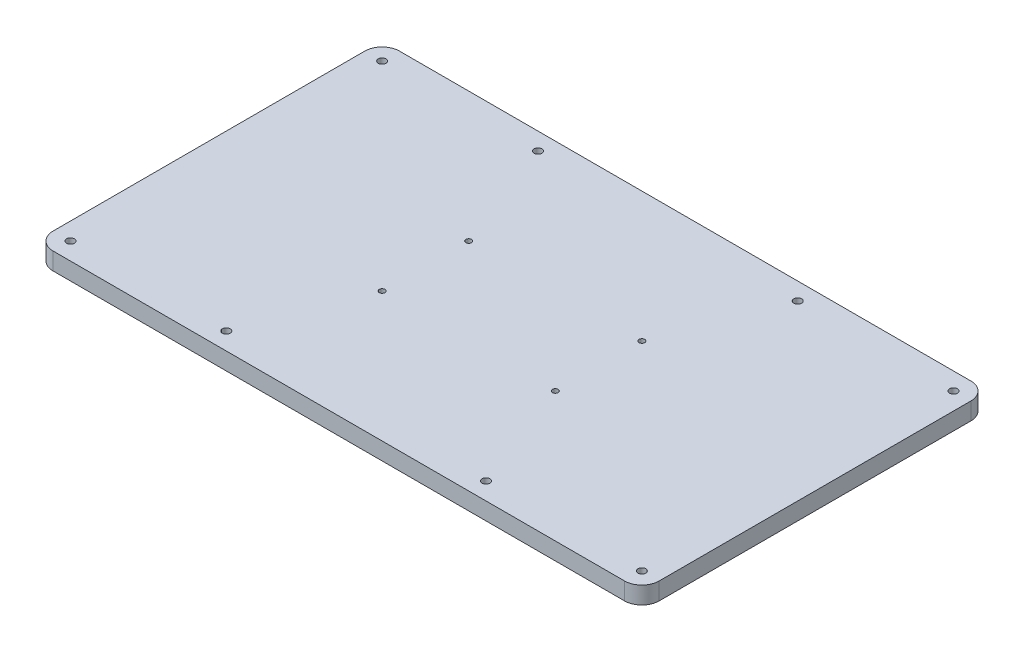
ISO-10303-21;
HEADER;
FILE_DESCRIPTION(('STEP AP214'),'2;1');
FILE_NAME('part.step','',(''),(''),'','','');
FILE_SCHEMA(('AUTOMOTIVE_DESIGN { 1 0 10303 214 1 1 1 1 }'));
ENDSEC;
DATA;
#1=APPLICATION_CONTEXT('core data for automotive mechanical design processes');
#2=APPLICATION_PROTOCOL_DEFINITION('international standard','automotive_design',2000,#1);
#3=PRODUCT_CONTEXT('',#1,'mechanical');
#4=PRODUCT('Part','Part','',(#3));
#5=PRODUCT_RELATED_PRODUCT_CATEGORY('part','',(#4));
#6=PRODUCT_DEFINITION_FORMATION('','',#4);
#7=PRODUCT_DEFINITION_CONTEXT('part definition',#1,'design');
#8=PRODUCT_DEFINITION('design','',#6,#7);
#9=PRODUCT_DEFINITION_SHAPE('','',#8);
#10=(LENGTH_UNIT() NAMED_UNIT(*) SI_UNIT(.MILLI.,.METRE.));
#11=(NAMED_UNIT(*) PLANE_ANGLE_UNIT() SI_UNIT($,.RADIAN.));
#12=(NAMED_UNIT(*) SI_UNIT($,.STERADIAN.) SOLID_ANGLE_UNIT());
#13=UNCERTAINTY_MEASURE_WITH_UNIT(LENGTH_MEASURE(1.E-05),#10,'distance_accuracy_value','');
#14=(GEOMETRIC_REPRESENTATION_CONTEXT(3) GLOBAL_UNCERTAINTY_ASSIGNED_CONTEXT((#13)) GLOBAL_UNIT_ASSIGNED_CONTEXT((#10,
#11,#12)) REPRESENTATION_CONTEXT('',''));
#15=CARTESIAN_POINT('',(0.,0.,0.));
#16=DIRECTION('',(0.,0.,1.));
#17=DIRECTION('',(1.,0.,0.));
#18=AXIS2_PLACEMENT_3D('',#15,#16,#17);
#19=CARTESIAN_POINT('',(0.,10.,0.));
#20=DIRECTION('',(1.,0.,0.));
#21=DIRECTION('',(0.,0.,-1.));
#22=AXIS2_PLACEMENT_3D('',#19,#20,#21);
#23=PLANE('',#22);
#24=DIRECTION('',(0.,0.,1.));
#25=VECTOR('',#24,1.);
#26=CARTESIAN_POINT('',(0.,10.,0.));
#27=LINE('',#26,#25);
#28=CARTESIAN_POINT('',(0.,10.,-190.));
#29=VERTEX_POINT('',#28);
#30=CARTESIAN_POINT('',(0.,10.,-10.));
#31=VERTEX_POINT('',#30);
#32=EDGE_CURVE('E132',#29,#31,#27,.T.);
#33=ORIENTED_EDGE('',*,*,#32,.F.);
#34=DIRECTION('',(0.,-1.,0.));
#35=VECTOR('',#34,1.);
#36=CARTESIAN_POINT('',(0.,10.,-190.));
#37=LINE('',#36,#35);
#38=CARTESIAN_POINT('',(0.,0.,-190.));
#39=VERTEX_POINT('',#38);
#40=EDGE_CURVE('E11',#29,#39,#37,.T.);
#41=ORIENTED_EDGE('',*,*,#40,.T.);
#42=DIRECTION('',(0.,0.,1.));
#43=VECTOR('',#42,1.);
#44=CARTESIAN_POINT('',(0.,0.,0.));
#45=LINE('',#44,#43);
#46=CARTESIAN_POINT('',(0.,0.,-10.));
#47=VERTEX_POINT('',#46);
#48=EDGE_CURVE('E134',#39,#47,#45,.T.);
#49=ORIENTED_EDGE('',*,*,#48,.T.);
#50=DIRECTION('',(0.,-1.,0.));
#51=VECTOR('',#50,1.);
#52=CARTESIAN_POINT('',(0.,10.,-10.));
#53=LINE('',#52,#51);
#54=EDGE_CURVE('E45',#47,#31,#53,.F.);
#55=ORIENTED_EDGE('',*,*,#54,.T.);
#56=EDGE_LOOP('',(#33,#41,#49,#55));
#57=FACE_BOUND('',#56,.T.);
#58=ADVANCED_FACE('F37',(#57),#23,.F.);
#59=CARTESIAN_POINT('',(0.,10.,0.));
#60=DIRECTION('',(0.,0.,-1.));
#61=DIRECTION('',(-1.,0.,0.));
#62=AXIS2_PLACEMENT_3D('',#59,#60,#61);
#63=PLANE('',#62);
#64=DIRECTION('',(1.,0.,0.));
#65=VECTOR('',#64,1.);
#66=CARTESIAN_POINT('',(0.,0.,0.));
#67=LINE('',#66,#65);
#68=CARTESIAN_POINT('',(10.,0.,0.));
#69=VERTEX_POINT('',#68);
#70=CARTESIAN_POINT('',(340.,0.,0.));
#71=VERTEX_POINT('',#70);
#72=EDGE_CURVE('E130',#69,#71,#67,.T.);
#73=ORIENTED_EDGE('',*,*,#72,.T.);
#74=DIRECTION('',(0.,-1.,0.));
#75=VECTOR('',#74,1.);
#76=CARTESIAN_POINT('',(340.,10.,0.));
#77=LINE('',#76,#75);
#78=CARTESIAN_POINT('',(340.,10.,0.));
#79=VERTEX_POINT('',#78);
#80=EDGE_CURVE('E109',#71,#79,#77,.F.);
#81=ORIENTED_EDGE('',*,*,#80,.T.);
#82=DIRECTION('',(1.,0.,0.));
#83=VECTOR('',#82,1.);
#84=CARTESIAN_POINT('',(0.,10.,0.));
#85=LINE('',#84,#83);
#86=CARTESIAN_POINT('',(10.,10.,0.));
#87=VERTEX_POINT('',#86);
#88=EDGE_CURVE('E170',#87,#79,#85,.T.);
#89=ORIENTED_EDGE('',*,*,#88,.F.);
#90=DIRECTION('',(0.,-1.,0.));
#91=VECTOR('',#90,1.);
#92=CARTESIAN_POINT('',(10.,10.,0.));
#93=LINE('',#92,#91);
#94=EDGE_CURVE('E114',#87,#69,#93,.T.);
#95=ORIENTED_EDGE('',*,*,#94,.T.);
#96=EDGE_LOOP('',(#73,#81,#89,#95));
#97=FACE_BOUND('',#96,.T.);
#98=ADVANCED_FACE('F174',(#97),#63,.F.);
#99=CARTESIAN_POINT('',(350.,10.,0.));
#100=DIRECTION('',(-1.,0.,0.));
#101=DIRECTION('',(0.,0.,1.));
#102=AXIS2_PLACEMENT_3D('',#99,#100,#101);
#103=PLANE('',#102);
#104=DIRECTION('',(0.,0.,-1.));
#105=VECTOR('',#104,1.);
#106=CARTESIAN_POINT('',(350.,10.,0.));
#107=LINE('',#106,#105);
#108=CARTESIAN_POINT('',(350.,10.,-10.));
#109=VERTEX_POINT('',#108);
#110=CARTESIAN_POINT('',(350.,10.,-190.));
#111=VERTEX_POINT('',#110);
#112=EDGE_CURVE('E123',#109,#111,#107,.T.);
#113=ORIENTED_EDGE('',*,*,#112,.F.);
#114=DIRECTION('',(0.,-1.,0.));
#115=VECTOR('',#114,1.);
#116=CARTESIAN_POINT('',(350.,10.,-10.));
#117=LINE('',#116,#115);
#118=CARTESIAN_POINT('',(350.,0.,-10.));
#119=VERTEX_POINT('',#118);
#120=EDGE_CURVE('E108',#109,#119,#117,.T.);
#121=ORIENTED_EDGE('',*,*,#120,.T.);
#122=DIRECTION('',(0.,0.,-1.));
#123=VECTOR('',#122,1.);
#124=CARTESIAN_POINT('',(350.,0.,0.));
#125=LINE('',#124,#123);
#126=CARTESIAN_POINT('',(350.,0.,-190.));
#127=VERTEX_POINT('',#126);
#128=EDGE_CURVE('E121',#119,#127,#125,.T.);
#129=ORIENTED_EDGE('',*,*,#128,.T.);
#130=DIRECTION('',(0.,-1.,0.));
#131=VECTOR('',#130,1.);
#132=CARTESIAN_POINT('',(350.,10.,-190.));
#133=LINE('',#132,#131);
#134=EDGE_CURVE('E125',#127,#111,#133,.F.);
#135=ORIENTED_EDGE('',*,*,#134,.T.);
#136=EDGE_LOOP('',(#113,#121,#129,#135));
#137=FACE_BOUND('',#136,.T.);
#138=ADVANCED_FACE('F120',(#137),#103,.F.);
#139=CARTESIAN_POINT('',(0.,10.,-200.));
#140=DIRECTION('',(0.,0.,1.));
#141=DIRECTION('',(1.,0.,0.));
#142=AXIS2_PLACEMENT_3D('',#139,#140,#141);
#143=PLANE('',#142);
#144=DIRECTION('',(-1.,0.,0.));
#145=VECTOR('',#144,1.);
#146=CARTESIAN_POINT('',(0.,10.,-200.));
#147=LINE('',#146,#145);
#148=CARTESIAN_POINT('',(340.,10.,-200.));
#149=VERTEX_POINT('',#148);
#150=CARTESIAN_POINT('',(10.,10.,-200.));
#151=VERTEX_POINT('',#150);
#152=EDGE_CURVE('E138',#149,#151,#147,.T.);
#153=ORIENTED_EDGE('',*,*,#152,.F.);
#154=DIRECTION('',(0.,-1.,0.));
#155=VECTOR('',#154,1.);
#156=CARTESIAN_POINT('',(340.,10.,-200.));
#157=LINE('',#156,#155);
#158=CARTESIAN_POINT('',(340.,0.,-200.));
#159=VERTEX_POINT('',#158);
#160=EDGE_CURVE('E155',#149,#159,#157,.T.);
#161=ORIENTED_EDGE('',*,*,#160,.T.);
#162=DIRECTION('',(-1.,0.,0.));
#163=VECTOR('',#162,1.);
#164=CARTESIAN_POINT('',(0.,0.,-200.));
#165=LINE('',#164,#163);
#166=CARTESIAN_POINT('',(10.,0.,-200.));
#167=VERTEX_POINT('',#166);
#168=EDGE_CURVE('E129',#159,#167,#165,.T.);
#169=ORIENTED_EDGE('',*,*,#168,.T.);
#170=DIRECTION('',(0.,-1.,0.));
#171=VECTOR('',#170,1.);
#172=CARTESIAN_POINT('',(10.,10.,-200.));
#173=LINE('',#172,#171);
#174=EDGE_CURVE('E52',#167,#151,#173,.F.);
#175=ORIENTED_EDGE('',*,*,#174,.T.);
#176=EDGE_LOOP('',(#153,#161,#169,#175));
#177=FACE_BOUND('',#176,.T.);
#178=ADVANCED_FACE('F256',(#177),#143,.F.);
#179=CARTESIAN_POINT('',(0.,10.,0.));
#180=DIRECTION('',(0.,-1.,0.));
#181=DIRECTION('',(0.,0.,-1.));
#182=AXIS2_PLACEMENT_3D('',#179,#180,#181);
#183=PLANE('',#182);
#184=CARTESIAN_POINT('',(10.,10.,-10.));
#185=DIRECTION('',(0.,1.,0.));
#186=DIRECTION('',(0.,0.,1.));
#187=AXIS2_PLACEMENT_3D('',#184,#185,#186);
#188=CIRCLE('',#187,2.24999999999999);
#189=CARTESIAN_POINT('',(10.,10.,-7.75000000000001));
#190=VERTEX_POINT('',#189);
#191=EDGE_CURVE('E248',#190,#190,#188,.T.);
#192=ORIENTED_EDGE('',*,*,#191,.F.);
#193=EDGE_LOOP('',(#192));
#194=FACE_BOUND('',#193,.T.);
#195=CARTESIAN_POINT('',(100.,10.,-10.));
#196=DIRECTION('',(0.,1.,0.));
#197=DIRECTION('',(0.,0.,1.));
#198=AXIS2_PLACEMENT_3D('',#195,#196,#197);
#199=CIRCLE('',#198,2.24999999999999);
#200=CARTESIAN_POINT('',(100.,10.,-7.75000000000001));
#201=VERTEX_POINT('',#200);
#202=EDGE_CURVE('E242',#201,#201,#199,.T.);
#203=ORIENTED_EDGE('',*,*,#202,.F.);
#204=EDGE_LOOP('',(#203));
#205=FACE_BOUND('',#204,.T.);
#206=CARTESIAN_POINT('',(100.,10.,-190.));
#207=DIRECTION('',(0.,1.,0.));
#208=DIRECTION('',(0.,0.,1.));
#209=AXIS2_PLACEMENT_3D('',#206,#207,#208);
#210=CIRCLE('',#209,2.24999999999999);
#211=CARTESIAN_POINT('',(100.,10.,-187.75));
#212=VERTEX_POINT('',#211);
#213=EDGE_CURVE('E236',#212,#212,#210,.T.);
#214=ORIENTED_EDGE('',*,*,#213,.F.);
#215=EDGE_LOOP('',(#214));
#216=FACE_BOUND('',#215,.T.);
#217=CARTESIAN_POINT('',(10.,10.,-190.));
#218=DIRECTION('',(0.,1.,0.));
#219=DIRECTION('',(0.,0.,1.));
#220=AXIS2_PLACEMENT_3D('',#217,#218,#219);
#221=CIRCLE('',#220,2.24999999999999);
#222=CARTESIAN_POINT('',(10.,10.,-187.75));
#223=VERTEX_POINT('',#222);
#224=EDGE_CURVE('E230',#223,#223,#221,.T.);
#225=ORIENTED_EDGE('',*,*,#224,.F.);
#226=EDGE_LOOP('',(#225));
#227=FACE_BOUND('',#226,.T.);
#228=CARTESIAN_POINT('',(250.,10.,-190.));
#229=DIRECTION('',(0.,1.,0.));
#230=DIRECTION('',(0.,0.,1.));
#231=AXIS2_PLACEMENT_3D('',#228,#229,#230);
#232=CIRCLE('',#231,2.24999999999997);
#233=CARTESIAN_POINT('',(250.,10.,-187.75));
#234=VERTEX_POINT('',#233);
#235=EDGE_CURVE('E224',#234,#234,#232,.T.);
#236=ORIENTED_EDGE('',*,*,#235,.F.);
#237=EDGE_LOOP('',(#236));
#238=FACE_BOUND('',#237,.T.);
#239=CARTESIAN_POINT('',(340.,10.,-190.));
#240=DIRECTION('',(0.,1.,0.));
#241=DIRECTION('',(0.,0.,1.));
#242=AXIS2_PLACEMENT_3D('',#239,#240,#241);
#243=CIRCLE('',#242,2.24999999999997);
#244=CARTESIAN_POINT('',(340.,10.,-187.75));
#245=VERTEX_POINT('',#244);
#246=EDGE_CURVE('E218',#245,#245,#243,.T.);
#247=ORIENTED_EDGE('',*,*,#246,.F.);
#248=EDGE_LOOP('',(#247));
#249=FACE_BOUND('',#248,.T.);
#250=CARTESIAN_POINT('',(340.,10.,-10.));
#251=DIRECTION('',(0.,1.,0.));
#252=DIRECTION('',(0.,0.,1.));
#253=AXIS2_PLACEMENT_3D('',#250,#251,#252);
#254=CIRCLE('',#253,2.24999999999997);
#255=CARTESIAN_POINT('',(340.,10.,-7.75000000000003));
#256=VERTEX_POINT('',#255);
#257=EDGE_CURVE('E212',#256,#256,#254,.T.);
#258=ORIENTED_EDGE('',*,*,#257,.F.);
#259=EDGE_LOOP('',(#258));
#260=FACE_BOUND('',#259,.T.);
#261=CARTESIAN_POINT('',(250.,10.,-10.));
#262=DIRECTION('',(0.,1.,0.));
#263=DIRECTION('',(0.,0.,1.));
#264=AXIS2_PLACEMENT_3D('',#261,#262,#263);
#265=CIRCLE('',#264,2.24999999999997);
#266=CARTESIAN_POINT('',(250.,10.,-7.75000000000003));
#267=VERTEX_POINT('',#266);
#268=EDGE_CURVE('E206',#267,#267,#265,.T.);
#269=ORIENTED_EDGE('',*,*,#268,.F.);
#270=EDGE_LOOP('',(#269));
#271=FACE_BOUND('',#270,.T.);
#272=CARTESIAN_POINT('',(125.,10.,-75.));
#273=DIRECTION('',(0.,1.,0.));
#274=DIRECTION('',(0.,0.,1.));
#275=AXIS2_PLACEMENT_3D('',#272,#273,#274);
#276=CIRCLE('',#275,1.65);
#277=CARTESIAN_POINT('',(125.,10.,-73.35));
#278=VERTEX_POINT('',#277);
#279=EDGE_CURVE('E200',#278,#278,#276,.T.);
#280=ORIENTED_EDGE('',*,*,#279,.F.);
#281=EDGE_LOOP('',(#280));
#282=FACE_BOUND('',#281,.T.);
#283=CARTESIAN_POINT('',(125.,10.,-125.));
#284=DIRECTION('',(0.,1.,0.));
#285=DIRECTION('',(0.,0.,1.));
#286=AXIS2_PLACEMENT_3D('',#283,#284,#285);
#287=CIRCLE('',#286,1.65);
#288=CARTESIAN_POINT('',(125.,10.,-123.35));
#289=VERTEX_POINT('',#288);
#290=EDGE_CURVE('E194',#289,#289,#287,.T.);
#291=ORIENTED_EDGE('',*,*,#290,.F.);
#292=EDGE_LOOP('',(#291));
#293=FACE_BOUND('',#292,.T.);
#294=CARTESIAN_POINT('',(225.,10.,-125.));
#295=DIRECTION('',(0.,1.,0.));
#296=DIRECTION('',(0.,0.,1.));
#297=AXIS2_PLACEMENT_3D('',#294,#295,#296);
#298=CIRCLE('',#297,1.64999999999998);
#299=CARTESIAN_POINT('',(225.,10.,-123.35));
#300=VERTEX_POINT('',#299);
#301=EDGE_CURVE('E188',#300,#300,#298,.T.);
#302=ORIENTED_EDGE('',*,*,#301,.F.);
#303=EDGE_LOOP('',(#302));
#304=FACE_BOUND('',#303,.T.);
#305=CARTESIAN_POINT('',(225.,10.,-75.));
#306=DIRECTION('',(0.,1.,0.));
#307=DIRECTION('',(0.,0.,1.));
#308=AXIS2_PLACEMENT_3D('',#305,#306,#307);
#309=CIRCLE('',#308,1.64999999999998);
#310=CARTESIAN_POINT('',(225.,10.,-73.35));
#311=VERTEX_POINT('',#310);
#312=EDGE_CURVE('E177',#311,#311,#309,.T.);
#313=ORIENTED_EDGE('',*,*,#312,.F.);
#314=EDGE_LOOP('',(#313));
#315=FACE_BOUND('',#314,.T.);
#316=ORIENTED_EDGE('',*,*,#88,.T.);
#317=CARTESIAN_POINT('',(340.,10.,-10.));
#318=DIRECTION('',(0.,-1.,0.));
#319=DIRECTION('',(0.,0.,-1.));
#320=AXIS2_PLACEMENT_3D('',#317,#318,#319);
#321=CIRCLE('',#320,10.);
#322=EDGE_CURVE('E152',#79,#109,#321,.F.);
#323=ORIENTED_EDGE('',*,*,#322,.T.);
#324=ORIENTED_EDGE('',*,*,#112,.T.);
#325=CARTESIAN_POINT('',(340.,10.,-190.));
#326=DIRECTION('',(0.,-1.,0.));
#327=DIRECTION('',(0.,0.,-1.));
#328=AXIS2_PLACEMENT_3D('',#325,#326,#327);
#329=CIRCLE('',#328,10.);
#330=EDGE_CURVE('E59',#111,#149,#329,.F.);
#331=ORIENTED_EDGE('',*,*,#330,.T.);
#332=ORIENTED_EDGE('',*,*,#152,.T.);
#333=CARTESIAN_POINT('',(10.,10.,-190.));
#334=DIRECTION('',(0.,-1.,0.));
#335=DIRECTION('',(0.,0.,-1.));
#336=AXIS2_PLACEMENT_3D('',#333,#334,#335);
#337=CIRCLE('',#336,10.);
#338=EDGE_CURVE('E149',#151,#29,#337,.F.);
#339=ORIENTED_EDGE('',*,*,#338,.T.);
#340=ORIENTED_EDGE('',*,*,#32,.T.);
#341=CARTESIAN_POINT('',(10.,10.,-10.));
#342=DIRECTION('',(0.,-1.,0.));
#343=DIRECTION('',(0.,0.,-1.));
#344=AXIS2_PLACEMENT_3D('',#341,#342,#343);
#345=CIRCLE('',#344,10.);
#346=EDGE_CURVE('E147',#31,#87,#345,.F.);
#347=ORIENTED_EDGE('',*,*,#346,.T.);
#348=EDGE_LOOP('',(#316,#323,#324,#331,#332,#339,#340,#347));
#349=FACE_BOUND('',#348,.T.);
#350=ADVANCED_FACE('F167',(#194,#205,#216,#227,#238,#249,#260,#271,#282,#293,#304,#315,#349),
#183,.F.);
#351=CARTESIAN_POINT('',(0.,0.,0.));
#352=DIRECTION('',(0.,-1.,0.));
#353=DIRECTION('',(0.,0.,-1.));
#354=AXIS2_PLACEMENT_3D('',#351,#352,#353);
#355=PLANE('',#354);
#356=CARTESIAN_POINT('',(10.,0.,-10.));
#357=DIRECTION('',(0.,1.,0.));
#358=DIRECTION('',(0.,0.,1.));
#359=AXIS2_PLACEMENT_3D('',#356,#357,#358);
#360=CIRCLE('',#359,2.25);
#361=CARTESIAN_POINT('',(10.,0.,-7.75));
#362=VERTEX_POINT('',#361);
#363=EDGE_CURVE('E245',#362,#362,#360,.T.);
#364=ORIENTED_EDGE('',*,*,#363,.T.);
#365=EDGE_LOOP('',(#364));
#366=FACE_BOUND('',#365,.T.);
#367=CARTESIAN_POINT('',(100.,0.,-10.));
#368=DIRECTION('',(0.,1.,0.));
#369=DIRECTION('',(0.,0.,1.));
#370=AXIS2_PLACEMENT_3D('',#367,#368,#369);
#371=CIRCLE('',#370,2.25);
#372=CARTESIAN_POINT('',(100.,0.,-7.75));
#373=VERTEX_POINT('',#372);
#374=EDGE_CURVE('E239',#373,#373,#371,.T.);
#375=ORIENTED_EDGE('',*,*,#374,.T.);
#376=EDGE_LOOP('',(#375));
#377=FACE_BOUND('',#376,.T.);
#378=CARTESIAN_POINT('',(100.,0.,-190.));
#379=DIRECTION('',(0.,1.,0.));
#380=DIRECTION('',(0.,0.,1.));
#381=AXIS2_PLACEMENT_3D('',#378,#379,#380);
#382=CIRCLE('',#381,2.25);
#383=CARTESIAN_POINT('',(100.,0.,-187.75));
#384=VERTEX_POINT('',#383);
#385=EDGE_CURVE('E233',#384,#384,#382,.T.);
#386=ORIENTED_EDGE('',*,*,#385,.T.);
#387=EDGE_LOOP('',(#386));
#388=FACE_BOUND('',#387,.T.);
#389=CARTESIAN_POINT('',(10.,0.,-190.));
#390=DIRECTION('',(0.,1.,0.));
#391=DIRECTION('',(0.,0.,1.));
#392=AXIS2_PLACEMENT_3D('',#389,#390,#391);
#393=CIRCLE('',#392,2.25);
#394=CARTESIAN_POINT('',(10.,0.,-187.75));
#395=VERTEX_POINT('',#394);
#396=EDGE_CURVE('E227',#395,#395,#393,.T.);
#397=ORIENTED_EDGE('',*,*,#396,.T.);
#398=EDGE_LOOP('',(#397));
#399=FACE_BOUND('',#398,.T.);
#400=CARTESIAN_POINT('',(250.,0.,-190.));
#401=DIRECTION('',(0.,1.,0.));
#402=DIRECTION('',(0.,0.,1.));
#403=AXIS2_PLACEMENT_3D('',#400,#401,#402);
#404=CIRCLE('',#403,2.24999999999997);
#405=CARTESIAN_POINT('',(250.,0.,-187.75));
#406=VERTEX_POINT('',#405);
#407=EDGE_CURVE('E221',#406,#406,#404,.T.);
#408=ORIENTED_EDGE('',*,*,#407,.T.);
#409=EDGE_LOOP('',(#408));
#410=FACE_BOUND('',#409,.T.);
#411=CARTESIAN_POINT('',(340.,0.,-190.));
#412=DIRECTION('',(0.,1.,0.));
#413=DIRECTION('',(0.,0.,1.));
#414=AXIS2_PLACEMENT_3D('',#411,#412,#413);
#415=CIRCLE('',#414,2.24999999999997);
#416=CARTESIAN_POINT('',(340.,0.,-187.75));
#417=VERTEX_POINT('',#416);
#418=EDGE_CURVE('E215',#417,#417,#415,.T.);
#419=ORIENTED_EDGE('',*,*,#418,.T.);
#420=EDGE_LOOP('',(#419));
#421=FACE_BOUND('',#420,.T.);
#422=CARTESIAN_POINT('',(340.,0.,-10.));
#423=DIRECTION('',(0.,1.,0.));
#424=DIRECTION('',(0.,0.,1.));
#425=AXIS2_PLACEMENT_3D('',#422,#423,#424);
#426=CIRCLE('',#425,2.24999999999997);
#427=CARTESIAN_POINT('',(340.,0.,-7.75000000000003));
#428=VERTEX_POINT('',#427);
#429=EDGE_CURVE('E209',#428,#428,#426,.T.);
#430=ORIENTED_EDGE('',*,*,#429,.T.);
#431=EDGE_LOOP('',(#430));
#432=FACE_BOUND('',#431,.T.);
#433=CARTESIAN_POINT('',(250.,0.,-10.));
#434=DIRECTION('',(0.,1.,0.));
#435=DIRECTION('',(0.,0.,1.));
#436=AXIS2_PLACEMENT_3D('',#433,#434,#435);
#437=CIRCLE('',#436,2.24999999999997);
#438=CARTESIAN_POINT('',(250.,0.,-7.75000000000003));
#439=VERTEX_POINT('',#438);
#440=EDGE_CURVE('E203',#439,#439,#437,.T.);
#441=ORIENTED_EDGE('',*,*,#440,.T.);
#442=EDGE_LOOP('',(#441));
#443=FACE_BOUND('',#442,.T.);
#444=CARTESIAN_POINT('',(125.,0.,-75.));
#445=DIRECTION('',(0.,1.,0.));
#446=DIRECTION('',(0.,0.,1.));
#447=AXIS2_PLACEMENT_3D('',#444,#445,#446);
#448=CIRCLE('',#447,1.65);
#449=CARTESIAN_POINT('',(125.,0.,-73.35));
#450=VERTEX_POINT('',#449);
#451=EDGE_CURVE('E197',#450,#450,#448,.T.);
#452=ORIENTED_EDGE('',*,*,#451,.T.);
#453=EDGE_LOOP('',(#452));
#454=FACE_BOUND('',#453,.T.);
#455=CARTESIAN_POINT('',(125.,0.,-125.));
#456=DIRECTION('',(0.,1.,0.));
#457=DIRECTION('',(0.,0.,1.));
#458=AXIS2_PLACEMENT_3D('',#455,#456,#457);
#459=CIRCLE('',#458,1.65);
#460=CARTESIAN_POINT('',(125.,0.,-123.35));
#461=VERTEX_POINT('',#460);
#462=EDGE_CURVE('E191',#461,#461,#459,.T.);
#463=ORIENTED_EDGE('',*,*,#462,.T.);
#464=EDGE_LOOP('',(#463));
#465=FACE_BOUND('',#464,.T.);
#466=CARTESIAN_POINT('',(225.,0.,-125.));
#467=DIRECTION('',(0.,1.,0.));
#468=DIRECTION('',(0.,0.,1.));
#469=AXIS2_PLACEMENT_3D('',#466,#467,#468);
#470=CIRCLE('',#469,1.64999999999998);
#471=CARTESIAN_POINT('',(225.,0.,-123.35));
#472=VERTEX_POINT('',#471);
#473=EDGE_CURVE('E185',#472,#472,#470,.T.);
#474=ORIENTED_EDGE('',*,*,#473,.T.);
#475=EDGE_LOOP('',(#474));
#476=FACE_BOUND('',#475,.T.);
#477=CARTESIAN_POINT('',(225.,0.,-75.));
#478=DIRECTION('',(0.,1.,0.));
#479=DIRECTION('',(0.,0.,1.));
#480=AXIS2_PLACEMENT_3D('',#477,#478,#479);
#481=CIRCLE('',#480,1.64999999999998);
#482=CARTESIAN_POINT('',(225.,0.,-73.35));
#483=VERTEX_POINT('',#482);
#484=EDGE_CURVE('E175',#483,#483,#481,.T.);
#485=ORIENTED_EDGE('',*,*,#484,.T.);
#486=EDGE_LOOP('',(#485));
#487=FACE_BOUND('',#486,.T.);
#488=ORIENTED_EDGE('',*,*,#128,.F.);
#489=CARTESIAN_POINT('',(340.,0.,-10.));
#490=DIRECTION('',(0.,-1.,0.));
#491=DIRECTION('',(0.,0.,-1.));
#492=AXIS2_PLACEMENT_3D('',#489,#490,#491);
#493=CIRCLE('',#492,10.);
#494=EDGE_CURVE('E104',#119,#71,#493,.T.);
#495=ORIENTED_EDGE('',*,*,#494,.T.);
#496=ORIENTED_EDGE('',*,*,#72,.F.);
#497=CARTESIAN_POINT('',(10.,0.,-10.));
#498=DIRECTION('',(0.,-1.,0.));
#499=DIRECTION('',(0.,0.,-1.));
#500=AXIS2_PLACEMENT_3D('',#497,#498,#499);
#501=CIRCLE('',#500,10.);
#502=EDGE_CURVE('E124',#69,#47,#501,.T.);
#503=ORIENTED_EDGE('',*,*,#502,.T.);
#504=ORIENTED_EDGE('',*,*,#48,.F.);
#505=CARTESIAN_POINT('',(10.,0.,-190.));
#506=DIRECTION('',(0.,-1.,0.));
#507=DIRECTION('',(0.,0.,-1.));
#508=AXIS2_PLACEMENT_3D('',#505,#506,#507);
#509=CIRCLE('',#508,10.);
#510=EDGE_CURVE('E141',#39,#167,#509,.T.);
#511=ORIENTED_EDGE('',*,*,#510,.T.);
#512=ORIENTED_EDGE('',*,*,#168,.F.);
#513=CARTESIAN_POINT('',(340.,0.,-190.));
#514=DIRECTION('',(0.,-1.,0.));
#515=DIRECTION('',(0.,0.,-1.));
#516=AXIS2_PLACEMENT_3D('',#513,#514,#515);
#517=CIRCLE('',#516,10.);
#518=EDGE_CURVE('E115',#159,#127,#517,.T.);
#519=ORIENTED_EDGE('',*,*,#518,.T.);
#520=EDGE_LOOP('',(#488,#495,#496,#503,#504,#511,#512,#519));
#521=FACE_BOUND('',#520,.T.);
#522=ADVANCED_FACE('F127',(#366,#377,#388,#399,#410,#421,#432,#443,#454,#465,#476,#487,#521),
#355,.T.);
#523=CARTESIAN_POINT('',(225.,10.,-75.));
#524=DIRECTION('',(0.,1.,0.));
#525=DIRECTION('',(0.,0.,1.));
#526=AXIS2_PLACEMENT_3D('',#523,#524,#525);
#527=CYLINDRICAL_SURFACE('',#526,1.64999999999998);
#528=ORIENTED_EDGE('',*,*,#484,.F.);
#529=EDGE_LOOP('',(#528));
#530=FACE_BOUND('',#529,.T.);
#531=ORIENTED_EDGE('',*,*,#312,.T.);
#532=EDGE_LOOP('',(#531));
#533=FACE_BOUND('',#532,.T.);
#534=ADVANCED_FACE('F280',(#530,#533),#527,.F.);
#535=CARTESIAN_POINT('',(225.,10.,-125.));
#536=DIRECTION('',(0.,1.,0.));
#537=DIRECTION('',(0.,0.,1.));
#538=AXIS2_PLACEMENT_3D('',#535,#536,#537);
#539=CYLINDRICAL_SURFACE('',#538,1.64999999999998);
#540=ORIENTED_EDGE('',*,*,#473,.F.);
#541=EDGE_LOOP('',(#540));
#542=FACE_BOUND('',#541,.T.);
#543=ORIENTED_EDGE('',*,*,#301,.T.);
#544=EDGE_LOOP('',(#543));
#545=FACE_BOUND('',#544,.T.);
#546=ADVANCED_FACE('F282',(#542,#545),#539,.F.);
#547=CARTESIAN_POINT('',(125.,10.,-125.));
#548=DIRECTION('',(0.,1.,0.));
#549=DIRECTION('',(0.,0.,1.));
#550=AXIS2_PLACEMENT_3D('',#547,#548,#549);
#551=CYLINDRICAL_SURFACE('',#550,1.65);
#552=ORIENTED_EDGE('',*,*,#462,.F.);
#553=EDGE_LOOP('',(#552));
#554=FACE_BOUND('',#553,.T.);
#555=ORIENTED_EDGE('',*,*,#290,.T.);
#556=EDGE_LOOP('',(#555));
#557=FACE_BOUND('',#556,.T.);
#558=ADVANCED_FACE('F289',(#554,#557),#551,.F.);
#559=CARTESIAN_POINT('',(125.,10.,-75.));
#560=DIRECTION('',(0.,1.,0.));
#561=DIRECTION('',(0.,0.,1.));
#562=AXIS2_PLACEMENT_3D('',#559,#560,#561);
#563=CYLINDRICAL_SURFACE('',#562,1.65);
#564=ORIENTED_EDGE('',*,*,#451,.F.);
#565=EDGE_LOOP('',(#564));
#566=FACE_BOUND('',#565,.T.);
#567=ORIENTED_EDGE('',*,*,#279,.T.);
#568=EDGE_LOOP('',(#567));
#569=FACE_BOUND('',#568,.T.);
#570=ADVANCED_FACE('F449',(#566,#569),#563,.F.);
#571=CARTESIAN_POINT('',(250.,10.,-10.));
#572=DIRECTION('',(0.,1.,0.));
#573=DIRECTION('',(0.,0.,1.));
#574=AXIS2_PLACEMENT_3D('',#571,#572,#573);
#575=CYLINDRICAL_SURFACE('',#574,2.24999999999997);
#576=ORIENTED_EDGE('',*,*,#440,.F.);
#577=EDGE_LOOP('',(#576));
#578=FACE_BOUND('',#577,.T.);
#579=ORIENTED_EDGE('',*,*,#268,.T.);
#580=EDGE_LOOP('',(#579));
#581=FACE_BOUND('',#580,.T.);
#582=ADVANCED_FACE('F439',(#578,#581),#575,.F.);
#583=CARTESIAN_POINT('',(340.,10.,-10.));
#584=DIRECTION('',(0.,1.,0.));
#585=DIRECTION('',(0.,0.,1.));
#586=AXIS2_PLACEMENT_3D('',#583,#584,#585);
#587=CYLINDRICAL_SURFACE('',#586,2.24999999999997);
#588=ORIENTED_EDGE('',*,*,#429,.F.);
#589=EDGE_LOOP('',(#588));
#590=FACE_BOUND('',#589,.T.);
#591=ORIENTED_EDGE('',*,*,#257,.T.);
#592=EDGE_LOOP('',(#591));
#593=FACE_BOUND('',#592,.T.);
#594=ADVANCED_FACE('F429',(#590,#593),#587,.F.);
#595=CARTESIAN_POINT('',(340.,10.,-190.));
#596=DIRECTION('',(0.,1.,0.));
#597=DIRECTION('',(0.,0.,1.));
#598=AXIS2_PLACEMENT_3D('',#595,#596,#597);
#599=CYLINDRICAL_SURFACE('',#598,2.24999999999997);
#600=ORIENTED_EDGE('',*,*,#418,.F.);
#601=EDGE_LOOP('',(#600));
#602=FACE_BOUND('',#601,.T.);
#603=ORIENTED_EDGE('',*,*,#246,.T.);
#604=EDGE_LOOP('',(#603));
#605=FACE_BOUND('',#604,.T.);
#606=ADVANCED_FACE('F419',(#602,#605),#599,.F.);
#607=CARTESIAN_POINT('',(250.,10.,-190.));
#608=DIRECTION('',(0.,1.,0.));
#609=DIRECTION('',(0.,0.,1.));
#610=AXIS2_PLACEMENT_3D('',#607,#608,#609);
#611=CYLINDRICAL_SURFACE('',#610,2.24999999999997);
#612=ORIENTED_EDGE('',*,*,#407,.F.);
#613=EDGE_LOOP('',(#612));
#614=FACE_BOUND('',#613,.T.);
#615=ORIENTED_EDGE('',*,*,#235,.T.);
#616=EDGE_LOOP('',(#615));
#617=FACE_BOUND('',#616,.T.);
#618=ADVANCED_FACE('F409',(#614,#617),#611,.F.);
#619=CARTESIAN_POINT('',(10.,10.,-190.));
#620=DIRECTION('',(0.,1.,0.));
#621=DIRECTION('',(0.,0.,1.));
#622=AXIS2_PLACEMENT_3D('',#619,#620,#621);
#623=CYLINDRICAL_SURFACE('',#622,2.24999999999999);
#624=ORIENTED_EDGE('',*,*,#396,.F.);
#625=EDGE_LOOP('',(#624));
#626=FACE_BOUND('',#625,.T.);
#627=ORIENTED_EDGE('',*,*,#224,.T.);
#628=EDGE_LOOP('',(#627));
#629=FACE_BOUND('',#628,.T.);
#630=ADVANCED_FACE('F399',(#626,#629),#623,.F.);
#631=CARTESIAN_POINT('',(100.,10.,-190.));
#632=DIRECTION('',(0.,1.,0.));
#633=DIRECTION('',(0.,0.,1.));
#634=AXIS2_PLACEMENT_3D('',#631,#632,#633);
#635=CYLINDRICAL_SURFACE('',#634,2.25);
#636=ORIENTED_EDGE('',*,*,#385,.F.);
#637=EDGE_LOOP('',(#636));
#638=FACE_BOUND('',#637,.T.);
#639=ORIENTED_EDGE('',*,*,#213,.T.);
#640=EDGE_LOOP('',(#639));
#641=FACE_BOUND('',#640,.T.);
#642=ADVANCED_FACE('F389',(#638,#641),#635,.F.);
#643=CARTESIAN_POINT('',(100.,10.,-10.));
#644=DIRECTION('',(0.,1.,0.));
#645=DIRECTION('',(0.,0.,1.));
#646=AXIS2_PLACEMENT_3D('',#643,#644,#645);
#647=CYLINDRICAL_SURFACE('',#646,2.25);
#648=ORIENTED_EDGE('',*,*,#374,.F.);
#649=EDGE_LOOP('',(#648));
#650=FACE_BOUND('',#649,.T.);
#651=ORIENTED_EDGE('',*,*,#202,.T.);
#652=EDGE_LOOP('',(#651));
#653=FACE_BOUND('',#652,.T.);
#654=ADVANCED_FACE('F379',(#650,#653),#647,.F.);
#655=CARTESIAN_POINT('',(10.,10.,-10.));
#656=DIRECTION('',(0.,1.,0.));
#657=DIRECTION('',(0.,0.,1.));
#658=AXIS2_PLACEMENT_3D('',#655,#656,#657);
#659=CYLINDRICAL_SURFACE('',#658,2.24999999999999);
#660=ORIENTED_EDGE('',*,*,#363,.F.);
#661=EDGE_LOOP('',(#660));
#662=FACE_BOUND('',#661,.T.);
#663=ORIENTED_EDGE('',*,*,#191,.T.);
#664=EDGE_LOOP('',(#663));
#665=FACE_BOUND('',#664,.T.);
#666=ADVANCED_FACE('F252',(#662,#665),#659,.F.);
#667=CARTESIAN_POINT('',(340.,10.,-10.));
#668=DIRECTION('',(0.,-1.,0.));
#669=DIRECTION('',(0.,0.,-1.));
#670=AXIS2_PLACEMENT_3D('',#667,#668,#669);
#671=CYLINDRICAL_SURFACE('',#670,10.);
#672=ORIENTED_EDGE('',*,*,#322,.F.);
#673=ORIENTED_EDGE('',*,*,#80,.F.);
#674=ORIENTED_EDGE('',*,*,#494,.F.);
#675=ORIENTED_EDGE('',*,*,#120,.F.);
#676=EDGE_LOOP('',(#672,#673,#674,#675));
#677=FACE_BOUND('',#676,.T.);
#678=ADVANCED_FACE('F107',(#677),#671,.T.);
#679=CARTESIAN_POINT('',(340.,10.,-190.));
#680=DIRECTION('',(0.,-1.,0.));
#681=DIRECTION('',(0.,0.,-1.));
#682=AXIS2_PLACEMENT_3D('',#679,#680,#681);
#683=CYLINDRICAL_SURFACE('',#682,10.);
#684=ORIENTED_EDGE('',*,*,#330,.F.);
#685=ORIENTED_EDGE('',*,*,#134,.F.);
#686=ORIENTED_EDGE('',*,*,#518,.F.);
#687=ORIENTED_EDGE('',*,*,#160,.F.);
#688=EDGE_LOOP('',(#684,#685,#686,#687));
#689=FACE_BOUND('',#688,.T.);
#690=ADVANCED_FACE('F305',(#689),#683,.T.);
#691=CARTESIAN_POINT('',(10.,10.,-190.));
#692=DIRECTION('',(0.,-1.,0.));
#693=DIRECTION('',(0.,0.,-1.));
#694=AXIS2_PLACEMENT_3D('',#691,#692,#693);
#695=CYLINDRICAL_SURFACE('',#694,10.);
#696=ORIENTED_EDGE('',*,*,#338,.F.);
#697=ORIENTED_EDGE('',*,*,#174,.F.);
#698=ORIENTED_EDGE('',*,*,#510,.F.);
#699=ORIENTED_EDGE('',*,*,#40,.F.);
#700=EDGE_LOOP('',(#696,#697,#698,#699));
#701=FACE_BOUND('',#700,.T.);
#702=ADVANCED_FACE('F307',(#701),#695,.T.);
#703=CARTESIAN_POINT('',(10.,10.,-10.));
#704=DIRECTION('',(0.,-1.,0.));
#705=DIRECTION('',(0.,0.,-1.));
#706=AXIS2_PLACEMENT_3D('',#703,#704,#705);
#707=CYLINDRICAL_SURFACE('',#706,10.);
#708=ORIENTED_EDGE('',*,*,#346,.F.);
#709=ORIENTED_EDGE('',*,*,#54,.F.);
#710=ORIENTED_EDGE('',*,*,#502,.F.);
#711=ORIENTED_EDGE('',*,*,#94,.F.);
#712=EDGE_LOOP('',(#708,#709,#710,#711));
#713=FACE_BOUND('',#712,.T.);
#714=ADVANCED_FACE('F39',(#713),#707,.T.);
#715=CLOSED_SHELL('',(#58,#98,#138,#178,#350,#522,#534,#546,#558,#570,#582,#594,#606,#618,#630,
#642,#654,#666,#678,#690,#702,#714));
#716=MANIFOLD_SOLID_BREP('B2',#715);
#717=ADVANCED_BREP_SHAPE_REPRESENTATION('',(#18,#716),#14);
#718=SHAPE_DEFINITION_REPRESENTATION(#9,#717);
ENDSEC;
END-ISO-10303-21;
